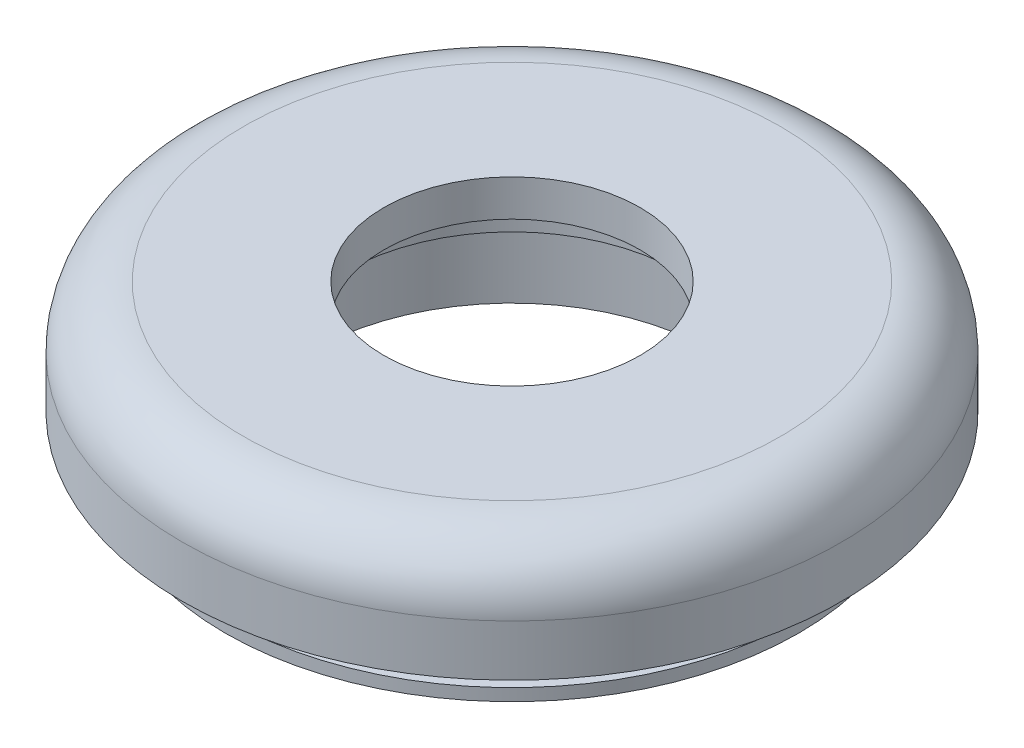
ISO-10303-21;
HEADER;
FILE_DESCRIPTION(('STEP AP214'),'2;1');
FILE_NAME('part.step','',(''),(''),'','','');
FILE_SCHEMA(('AUTOMOTIVE_DESIGN { 1 0 10303 214 1 1 1 1 }'));
ENDSEC;
DATA;
#1=APPLICATION_CONTEXT('core data for automotive mechanical design processes');
#2=APPLICATION_PROTOCOL_DEFINITION('international standard','automotive_design',2000,#1);
#3=PRODUCT_CONTEXT('',#1,'mechanical');
#4=PRODUCT('Part','Part','',(#3));
#5=PRODUCT_RELATED_PRODUCT_CATEGORY('part','',(#4));
#6=PRODUCT_DEFINITION_FORMATION('','',#4);
#7=PRODUCT_DEFINITION_CONTEXT('part definition',#1,'design');
#8=PRODUCT_DEFINITION('design','',#6,#7);
#9=PRODUCT_DEFINITION_SHAPE('','',#8);
#10=(LENGTH_UNIT() NAMED_UNIT(*) SI_UNIT(.MILLI.,.METRE.));
#11=(NAMED_UNIT(*) PLANE_ANGLE_UNIT() SI_UNIT($,.RADIAN.));
#12=(NAMED_UNIT(*) SI_UNIT($,.STERADIAN.) SOLID_ANGLE_UNIT());
#13=UNCERTAINTY_MEASURE_WITH_UNIT(LENGTH_MEASURE(1.E-05),#10,'distance_accuracy_value','');
#14=(GEOMETRIC_REPRESENTATION_CONTEXT(3) GLOBAL_UNCERTAINTY_ASSIGNED_CONTEXT((#13)) GLOBAL_UNIT_ASSIGNED_CONTEXT((#10,
#11,#12)) REPRESENTATION_CONTEXT('',''));
#15=CARTESIAN_POINT('',(0.,0.,0.));
#16=DIRECTION('',(0.,0.,1.));
#17=DIRECTION('',(1.,0.,0.));
#18=AXIS2_PLACEMENT_3D('',#15,#16,#17);
#19=CARTESIAN_POINT('',(-13.75,0.,0.));
#20=DIRECTION('',(0.,1.,0.));
#21=DIRECTION('',(0.,0.,1.));
#22=AXIS2_PLACEMENT_3D('',#19,#20,#21);
#23=PLANE('',#22);
#24=CARTESIAN_POINT('',(0.,0.,0.));
#25=DIRECTION('',(0.,-1.,0.));
#26=DIRECTION('',(0.,0.,-1.));
#27=AXIS2_PLACEMENT_3D('',#24,#25,#26);
#28=CIRCLE('',#27,13.75);
#29=CARTESIAN_POINT('',(0.,0.,-13.75));
#30=VERTEX_POINT('',#29);
#31=EDGE_CURVE('E45',#30,#30,#28,.T.);
#32=ORIENTED_EDGE('',*,*,#31,.F.);
#33=EDGE_LOOP('',(#32));
#34=FACE_BOUND('',#33,.T.);
#35=CARTESIAN_POINT('',(0.,0.,0.));
#36=DIRECTION('',(0.,-1.,0.));
#37=DIRECTION('',(0.,0.,-1.));
#38=AXIS2_PLACEMENT_3D('',#35,#36,#37);
#39=CIRCLE('',#38,16.5);
#40=CARTESIAN_POINT('',(0.,0.,-16.5));
#41=VERTEX_POINT('',#40);
#42=EDGE_CURVE('E78',#41,#41,#39,.T.);
#43=ORIENTED_EDGE('',*,*,#42,.T.);
#44=EDGE_LOOP('',(#43));
#45=FACE_BOUND('',#44,.T.);
#46=ADVANCED_FACE('F34',(#34,#45),#23,.F.);
#47=CARTESIAN_POINT('',(0.,0.,0.));
#48=DIRECTION('',(0.,-1.,0.));
#49=DIRECTION('',(0.,0.,-1.));
#50=AXIS2_PLACEMENT_3D('',#47,#48,#49);
#51=CYLINDRICAL_SURFACE('',#50,13.75);
#52=CARTESIAN_POINT('',(0.,3.2,0.));
#53=DIRECTION('',(0.,-1.,0.));
#54=DIRECTION('',(0.,0.,-1.));
#55=AXIS2_PLACEMENT_3D('',#52,#53,#54);
#56=CIRCLE('',#55,13.75);
#57=CARTESIAN_POINT('',(0.,3.2,-13.75));
#58=VERTEX_POINT('',#57);
#59=EDGE_CURVE('E49',#58,#58,#56,.T.);
#60=ORIENTED_EDGE('',*,*,#59,.F.);
#61=EDGE_LOOP('',(#60));
#62=FACE_BOUND('',#61,.T.);
#63=ORIENTED_EDGE('',*,*,#31,.T.);
#64=EDGE_LOOP('',(#63));
#65=FACE_BOUND('',#64,.T.);
#66=ADVANCED_FACE('F129',(#62,#65),#51,.F.);
#67=CARTESIAN_POINT('',(-10.5,3.2,0.));
#68=DIRECTION('',(0.,1.,0.));
#69=DIRECTION('',(0.,0.,1.));
#70=AXIS2_PLACEMENT_3D('',#67,#68,#69);
#71=PLANE('',#70);
#72=CARTESIAN_POINT('',(0.,3.2,0.));
#73=DIRECTION('',(0.,-1.,0.));
#74=DIRECTION('',(0.,0.,-1.));
#75=AXIS2_PLACEMENT_3D('',#72,#73,#74);
#76=CIRCLE('',#75,10.5);
#77=CARTESIAN_POINT('',(0.,3.2,-10.5));
#78=VERTEX_POINT('',#77);
#79=EDGE_CURVE('E54',#78,#78,#76,.T.);
#80=ORIENTED_EDGE('',*,*,#79,.F.);
#81=EDGE_LOOP('',(#80));
#82=FACE_BOUND('',#81,.T.);
#83=ORIENTED_EDGE('',*,*,#59,.T.);
#84=EDGE_LOOP('',(#83));
#85=FACE_BOUND('',#84,.T.);
#86=ADVANCED_FACE('F134',(#82,#85),#71,.F.);
#87=CARTESIAN_POINT('',(0.,0.,0.));
#88=DIRECTION('',(0.,-1.,0.));
#89=DIRECTION('',(0.,0.,-1.));
#90=AXIS2_PLACEMENT_3D('',#87,#88,#89);
#91=CYLINDRICAL_SURFACE('',#90,10.5);
#92=CARTESIAN_POINT('',(0.,6.2,0.));
#93=DIRECTION('',(0.,-1.,0.));
#94=DIRECTION('',(0.,0.,-1.));
#95=AXIS2_PLACEMENT_3D('',#92,#93,#94);
#96=CIRCLE('',#95,10.5);
#97=CARTESIAN_POINT('',(0.,6.2,-10.5));
#98=VERTEX_POINT('',#97);
#99=EDGE_CURVE('E57',#98,#98,#96,.T.);
#100=ORIENTED_EDGE('',*,*,#99,.F.);
#101=EDGE_LOOP('',(#100));
#102=FACE_BOUND('',#101,.T.);
#103=ORIENTED_EDGE('',*,*,#79,.T.);
#104=EDGE_LOOP('',(#103));
#105=FACE_BOUND('',#104,.T.);
#106=ADVANCED_FACE('F126',(#102,#105),#91,.F.);
#107=CARTESIAN_POINT('',(-27.,6.2,0.));
#108=DIRECTION('',(0.,-1.,0.));
#109=DIRECTION('',(0.,0.,-1.));
#110=AXIS2_PLACEMENT_3D('',#107,#108,#109);
#111=PLANE('',#110);
#112=CARTESIAN_POINT('',(0.,6.2,0.));
#113=DIRECTION('',(0.,-1.,0.));
#114=DIRECTION('',(0.,0.,-1.));
#115=AXIS2_PLACEMENT_3D('',#112,#113,#114);
#116=CIRCLE('',#115,22.);
#117=CARTESIAN_POINT('',(0.,6.2,-22.));
#118=VERTEX_POINT('',#117);
#119=EDGE_CURVE('E10',#118,#118,#116,.F.);
#120=ORIENTED_EDGE('',*,*,#119,.T.);
#121=EDGE_LOOP('',(#120));
#122=FACE_BOUND('',#121,.T.);
#123=ORIENTED_EDGE('',*,*,#99,.T.);
#124=EDGE_LOOP('',(#123));
#125=FACE_BOUND('',#124,.T.);
#126=ADVANCED_FACE('F121',(#122,#125),#111,.F.);
#127=CARTESIAN_POINT('',(0.,0.,0.));
#128=DIRECTION('',(0.,-1.,0.));
#129=DIRECTION('',(0.,0.,-1.));
#130=AXIS2_PLACEMENT_3D('',#127,#128,#129);
#131=CYLINDRICAL_SURFACE('',#130,27.);
#132=CARTESIAN_POINT('',(0.,1.2,0.));
#133=DIRECTION('',(0.,-1.,0.));
#134=DIRECTION('',(0.,0.,-1.));
#135=AXIS2_PLACEMENT_3D('',#132,#133,#134);
#136=CIRCLE('',#135,27.);
#137=CARTESIAN_POINT('',(0.,1.2,-27.));
#138=VERTEX_POINT('',#137);
#139=EDGE_CURVE('E41',#138,#138,#136,.T.);
#140=ORIENTED_EDGE('',*,*,#139,.T.);
#141=EDGE_LOOP('',(#140));
#142=FACE_BOUND('',#141,.T.);
#143=CARTESIAN_POINT('',(0.,-3.,0.));
#144=DIRECTION('',(0.,-1.,0.));
#145=DIRECTION('',(0.,0.,-1.));
#146=AXIS2_PLACEMENT_3D('',#143,#144,#145);
#147=CIRCLE('',#146,27.);
#148=CARTESIAN_POINT('',(0.,-3.,-27.));
#149=VERTEX_POINT('',#148);
#150=EDGE_CURVE('E60',#149,#149,#147,.T.);
#151=ORIENTED_EDGE('',*,*,#150,.F.);
#152=EDGE_LOOP('',(#151));
#153=FACE_BOUND('',#152,.T.);
#154=ADVANCED_FACE('F116',(#142,#153),#131,.T.);
#155=CARTESIAN_POINT('',(-20.9,-3.,0.));
#156=DIRECTION('',(0.,1.,0.));
#157=DIRECTION('',(0.,0.,1.));
#158=AXIS2_PLACEMENT_3D('',#155,#156,#157);
#159=PLANE('',#158);
#160=CARTESIAN_POINT('',(0.,-3.,0.));
#161=DIRECTION('',(0.,-1.,0.));
#162=DIRECTION('',(0.,0.,-1.));
#163=AXIS2_PLACEMENT_3D('',#160,#161,#162);
#164=CIRCLE('',#163,20.9);
#165=CARTESIAN_POINT('',(0.,-3.,-20.9));
#166=VERTEX_POINT('',#165);
#167=EDGE_CURVE('E63',#166,#166,#164,.T.);
#168=ORIENTED_EDGE('',*,*,#167,.F.);
#169=EDGE_LOOP('',(#168));
#170=FACE_BOUND('',#169,.T.);
#171=ORIENTED_EDGE('',*,*,#150,.T.);
#172=EDGE_LOOP('',(#171));
#173=FACE_BOUND('',#172,.T.);
#174=ADVANCED_FACE('F110',(#170,#173),#159,.F.);
#175=CARTESIAN_POINT('',(0.,0.,0.));
#176=DIRECTION('',(0.,-1.,0.));
#177=DIRECTION('',(0.,0.,-1.));
#178=AXIS2_PLACEMENT_3D('',#175,#176,#177);
#179=CYLINDRICAL_SURFACE('',#178,20.9);
#180=CARTESIAN_POINT('',(0.,-6.,0.));
#181=DIRECTION('',(0.,-1.,0.));
#182=DIRECTION('',(0.,0.,-1.));
#183=AXIS2_PLACEMENT_3D('',#180,#181,#182);
#184=CIRCLE('',#183,20.9);
#185=CARTESIAN_POINT('',(0.,-6.,-20.9));
#186=VERTEX_POINT('',#185);
#187=EDGE_CURVE('E66',#186,#186,#184,.T.);
#188=ORIENTED_EDGE('',*,*,#187,.F.);
#189=EDGE_LOOP('',(#188));
#190=FACE_BOUND('',#189,.T.);
#191=ORIENTED_EDGE('',*,*,#167,.T.);
#192=EDGE_LOOP('',(#191));
#193=FACE_BOUND('',#192,.T.);
#194=ADVANCED_FACE('F104',(#190,#193),#179,.T.);
#195=CARTESIAN_POINT('',(-20.9,-6.,0.));
#196=DIRECTION('',(0.,-1.,0.));
#197=DIRECTION('',(0.,0.,-1.));
#198=AXIS2_PLACEMENT_3D('',#195,#196,#197);
#199=PLANE('',#198);
#200=CARTESIAN_POINT('',(0.,-6.,0.));
#201=DIRECTION('',(0.,-1.,0.));
#202=DIRECTION('',(0.,0.,-1.));
#203=AXIS2_PLACEMENT_3D('',#200,#201,#202);
#204=CIRCLE('',#203,23.5);
#205=CARTESIAN_POINT('',(0.,-6.,-23.5));
#206=VERTEX_POINT('',#205);
#207=EDGE_CURVE('E69',#206,#206,#204,.T.);
#208=ORIENTED_EDGE('',*,*,#207,.F.);
#209=EDGE_LOOP('',(#208));
#210=FACE_BOUND('',#209,.T.);
#211=ORIENTED_EDGE('',*,*,#187,.T.);
#212=EDGE_LOOP('',(#211));
#213=FACE_BOUND('',#212,.T.);
#214=ADVANCED_FACE('F98',(#210,#213),#199,.F.);
#215=CARTESIAN_POINT('',(0.,0.,0.));
#216=DIRECTION('',(0.,-1.,0.));
#217=DIRECTION('',(0.,0.,-1.));
#218=AXIS2_PLACEMENT_3D('',#215,#216,#217);
#219=CYLINDRICAL_SURFACE('',#218,23.5);
#220=CARTESIAN_POINT('',(0.,-7.,0.));
#221=DIRECTION('',(0.,-1.,0.));
#222=DIRECTION('',(0.,0.,-1.));
#223=AXIS2_PLACEMENT_3D('',#220,#221,#222);
#224=CIRCLE('',#223,23.5);
#225=CARTESIAN_POINT('',(0.,-7.,-23.5));
#226=VERTEX_POINT('',#225);
#227=EDGE_CURVE('E72',#226,#226,#224,.T.);
#228=ORIENTED_EDGE('',*,*,#227,.F.);
#229=EDGE_LOOP('',(#228));
#230=FACE_BOUND('',#229,.T.);
#231=ORIENTED_EDGE('',*,*,#207,.T.);
#232=EDGE_LOOP('',(#231));
#233=FACE_BOUND('',#232,.T.);
#234=ADVANCED_FACE('F92',(#230,#233),#219,.T.);
#235=CARTESIAN_POINT('',(-23.5,-7.,0.));
#236=DIRECTION('',(0.,1.,0.));
#237=DIRECTION('',(0.,0.,1.));
#238=AXIS2_PLACEMENT_3D('',#235,#236,#237);
#239=PLANE('',#238);
#240=CARTESIAN_POINT('',(0.,-7.,0.));
#241=DIRECTION('',(0.,-1.,0.));
#242=DIRECTION('',(0.,0.,-1.));
#243=AXIS2_PLACEMENT_3D('',#240,#241,#242);
#244=CIRCLE('',#243,16.5);
#245=CARTESIAN_POINT('',(0.,-7.,-16.5));
#246=VERTEX_POINT('',#245);
#247=EDGE_CURVE('E75',#246,#246,#244,.T.);
#248=ORIENTED_EDGE('',*,*,#247,.F.);
#249=EDGE_LOOP('',(#248));
#250=FACE_BOUND('',#249,.T.);
#251=ORIENTED_EDGE('',*,*,#227,.T.);
#252=EDGE_LOOP('',(#251));
#253=FACE_BOUND('',#252,.T.);
#254=ADVANCED_FACE('F86',(#250,#253),#239,.F.);
#255=CARTESIAN_POINT('',(0.,0.,0.));
#256=DIRECTION('',(0.,-1.,0.));
#257=DIRECTION('',(0.,0.,-1.));
#258=AXIS2_PLACEMENT_3D('',#255,#256,#257);
#259=CYLINDRICAL_SURFACE('',#258,16.5);
#260=ORIENTED_EDGE('',*,*,#42,.F.);
#261=EDGE_LOOP('',(#260));
#262=FACE_BOUND('',#261,.T.);
#263=ORIENTED_EDGE('',*,*,#247,.T.);
#264=EDGE_LOOP('',(#263));
#265=FACE_BOUND('',#264,.T.);
#266=ADVANCED_FACE('F83',(#262,#265),#259,.F.);
#267=CARTESIAN_POINT('',(0.,1.2,0.));
#268=DIRECTION('',(0.,-1.,0.));
#269=DIRECTION('',(0.,0.,-1.));
#270=AXIS2_PLACEMENT_3D('',#267,#268,#269);
#271=TOROIDAL_SURFACE('',#270,22.,5.);
#272=ORIENTED_EDGE('',*,*,#119,.F.);
#273=EDGE_LOOP('',(#272));
#274=FACE_BOUND('',#273,.T.);
#275=ORIENTED_EDGE('',*,*,#139,.F.);
#276=EDGE_LOOP('',(#275));
#277=FACE_BOUND('',#276,.T.);
#278=ADVANCED_FACE('F36',(#274,#277),#271,.T.);
#279=CLOSED_SHELL('',(#46,#66,#86,#106,#126,#154,#174,#194,#214,#234,#254,#266,#278));
#280=MANIFOLD_SOLID_BREP('B2',#279);
#281=ADVANCED_BREP_SHAPE_REPRESENTATION('',(#18,#280),#14);
#282=SHAPE_DEFINITION_REPRESENTATION(#9,#281);
ENDSEC;
END-ISO-10303-21;
